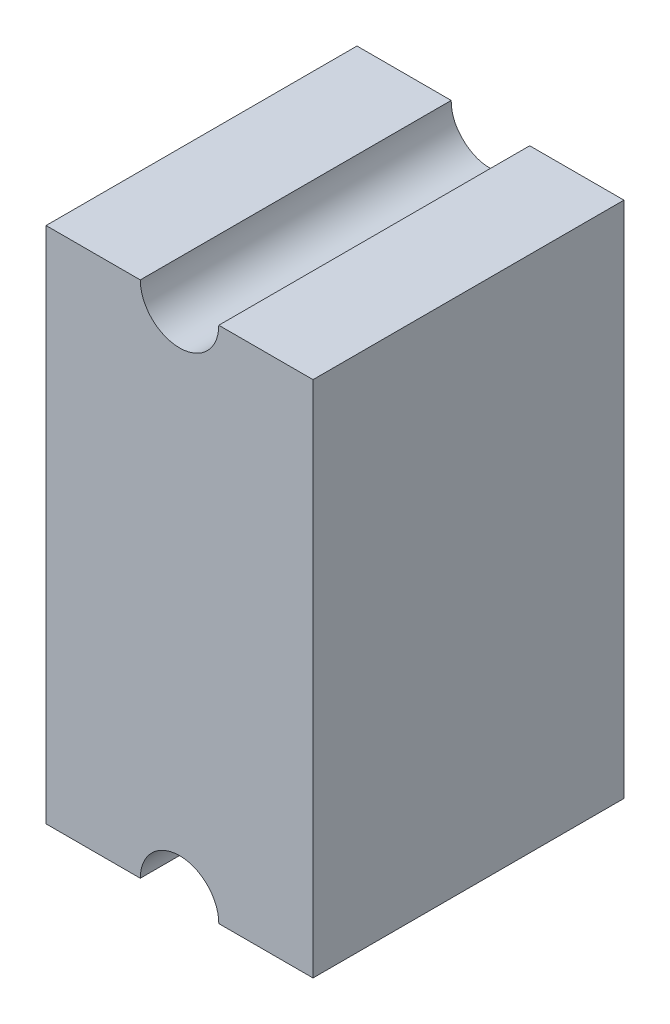
ISO-10303-21;
HEADER;
FILE_DESCRIPTION(('STEP AP214'),'2;1');
FILE_NAME('part.step','',(''),(''),'','','');
FILE_SCHEMA(('AUTOMOTIVE_DESIGN { 1 0 10303 214 1 1 1 1 }'));
ENDSEC;
DATA;
#1=APPLICATION_CONTEXT('core data for automotive mechanical design processes');
#2=APPLICATION_PROTOCOL_DEFINITION('international standard','automotive_design',2000,#1);
#3=PRODUCT_CONTEXT('',#1,'mechanical');
#4=PRODUCT('Part','Part','',(#3));
#5=PRODUCT_RELATED_PRODUCT_CATEGORY('part','',(#4));
#6=PRODUCT_DEFINITION_FORMATION('','',#4);
#7=PRODUCT_DEFINITION_CONTEXT('part definition',#1,'design');
#8=PRODUCT_DEFINITION('design','',#6,#7);
#9=PRODUCT_DEFINITION_SHAPE('','',#8);
#10=(LENGTH_UNIT() NAMED_UNIT(*) SI_UNIT(.MILLI.,.METRE.));
#11=(NAMED_UNIT(*) PLANE_ANGLE_UNIT() SI_UNIT($,.RADIAN.));
#12=(NAMED_UNIT(*) SI_UNIT($,.STERADIAN.) SOLID_ANGLE_UNIT());
#13=UNCERTAINTY_MEASURE_WITH_UNIT(LENGTH_MEASURE(1.E-05),#10,'distance_accuracy_value','');
#14=(GEOMETRIC_REPRESENTATION_CONTEXT(3) GLOBAL_UNCERTAINTY_ASSIGNED_CONTEXT((#13)) GLOBAL_UNIT_ASSIGNED_CONTEXT((#10,
#11,#12)) REPRESENTATION_CONTEXT('',''));
#15=CARTESIAN_POINT('',(0.,0.,0.));
#16=DIRECTION('',(0.,0.,1.));
#17=DIRECTION('',(1.,0.,0.));
#18=AXIS2_PLACEMENT_3D('',#15,#16,#17);
#19=CARTESIAN_POINT('',(-7.018385304232,-14.99348643989,-2.61150951267));
#20=DIRECTION('',(8.74227755153593E-08,-8.74227776159793E-08,0.999999999999992));
#21=DIRECTION('',(0.,-0.999999999999996,-8.74227776159797E-08));
#22=AXIS2_PLACEMENT_3D('',#19,#20,#21);
#23=PLANE('',#22);
#24=CARTESIAN_POINT('',(-6.718385304828,-15.04348643631,-2.61150954326797));
#25=DIRECTION('',(-0.999999999999996,0.,8.74227753560529E-08));
#26=VECTOR('',#25,1.);
#27=LINE('',#24,#26);
#28=CARTESIAN_POINT('',(-6.718385304236,-15.043486439885,-2.61155954326797));
#29=VERTEX_POINT('',#28);
#30=CARTESIAN_POINT('',(-7.318385304236,-15.043486439885,-2.61155949081431));
#31=VERTEX_POINT('',#30);
#32=EDGE_CURVE('E144',#29,#31,#27,.T.);
#33=ORIENTED_EDGE('',*,*,#32,.T.);
#34=CARTESIAN_POINT('',(-7.318385303635,-15.04348643631,-2.61150949081431));
#35=DIRECTION('',(0.,0.999999999999996,8.74227792732975E-08));
#36=VECTOR('',#35,1.);
#37=LINE('',#34,#36);
#38=CARTESIAN_POINT('',(-7.318385304236,-14.94348643989,-2.61155948207203));
#39=VERTEX_POINT('',#38);
#40=EDGE_CURVE('E219',#31,#39,#37,.T.);
#41=ORIENTED_EDGE('',*,*,#40,.T.);
#42=CARTESIAN_POINT('',(-7.318385303635,-14.94348644347,-2.61150948207203));
#43=DIRECTION('',(0.999999999999996,0.,-8.74227753560529E-08));
#44=VECTOR('',#43,1.);
#45=LINE('',#42,#44);
#46=CARTESIAN_POINT('',(-6.718385304236,-14.94348643989,-2.61155953452569));
#47=VERTEX_POINT('',#46);
#48=EDGE_CURVE('E207',#39,#47,#45,.T.);
#49=ORIENTED_EDGE('',*,*,#48,.T.);
#50=CARTESIAN_POINT('',(-6.718385304828,-14.94348644347,-2.61150953452569));
#51=DIRECTION('',(0.,-0.999999999999996,-8.74227792732975E-08));
#52=VECTOR('',#51,1.);
#53=LINE('',#50,#52);
#54=EDGE_CURVE('E369',#47,#29,#53,.T.);
#55=ORIENTED_EDGE('',*,*,#54,.T.);
#56=EDGE_LOOP('',(#33,#41,#49,#55));
#57=FACE_BOUND('',#56,.T.);
#58=ADVANCED_FACE('F17',(#57),#23,.F.);
#59=CARTESIAN_POINT('',(-7.018385295419,-14.25446878829,-2.611509448063));
#60=DIRECTION('',(8.74227755153593E-08,-8.74227776159793E-08,0.999999999999992));
#61=DIRECTION('',(0.,-0.999999999999996,-8.74227776159797E-08));
#62=AXIS2_PLACEMENT_3D('',#59,#60,#61);
#63=PLANE('',#62);
#64=DIRECTION('',(1.,-1.19248800417599E-08,0.));
#65=VECTOR('',#64,1.);
#66=CARTESIAN_POINT('',(-6.593385294402,-14.1684864449587,-2.611509455845));
#67=LINE('',#66,#65);
#68=CARTESIAN_POINT('',(-6.843385294398,-14.1684864419741,-2.61155945584509));
#69=VERTEX_POINT('',#68);
#70=CARTESIAN_POINT('',(-6.89338529439382,-14.168486441381,-2.61150945365968));
#71=VERTEX_POINT('',#70);
#72=EDGE_CURVE('E141',#69,#71,#67,.F.);
#73=ORIENTED_EDGE('',*,*,#72,.F.);
#74=CARTESIAN_POINT('',(-6.843385294394,-14.16848644198,-2.61150945584517));
#75=CARTESIAN_POINT('',(-6.84338529527116,-14.2419328941304,-2.61150946226606));
#76=CARTESIAN_POINT('',(-6.89464160916365,-14.2922301280749,-2.61150946218222));
#77=CARTESIAN_POINT('',(-6.94745987459995,-14.3440600871852,-2.61150946209582));
#78=CARTESIAN_POINT('',(-7.01838529648243,-14.34348643989,-2.61150945584517));
#79=CARTESIAN_POINT('',(-7.09241933342863,-14.3428876500073,-2.61150944932056));
#80=CARTESIAN_POINT('',(-7.14212898257783,-14.2922301251205,-2.61150944054618));
#81=CARTESIAN_POINT('',(-7.19338529524675,-14.2399964445561,-2.6115094314988));
#82=CARTESIAN_POINT('',(-7.193385294394,-14.1684864378,-2.6115094252472));
#83=B_SPLINE_CURVE_WITH_KNOTS('',2,(#74,#75,#76,#77,#78,#79,#80,#81,#82),.UNSPECIFIED.,.F.,.F.,
(3,2,2,2,3),(0.,0.25,0.5,0.75,1.),.UNSPECIFIED.);
#84=CARTESIAN_POINT('',(-7.193385294398,-14.1684864378006,-2.61155942524741));
#85=VERTEX_POINT('',#84);
#86=EDGE_CURVE('E151',#69,#85,#83,.T.);
#87=ORIENTED_EDGE('',*,*,#86,.T.);
#88=DIRECTION('',(1.,-1.19248800417599E-08,0.));
#89=VECTOR('',#88,1.);
#90=CARTESIAN_POINT('',(-7.143385294402,-14.1684864383987,-2.611509429619));
#91=LINE('',#90,#89);
#92=CARTESIAN_POINT('',(-7.14338525112381,-14.1684864383994,-2.61150942961883));
#93=VERTEX_POINT('',#92);
#94=EDGE_CURVE('E116',#93,#85,#91,.F.);
#95=ORIENTED_EDGE('',*,*,#94,.F.);
#96=CARTESIAN_POINT('',(-7.143385294394,-14.1684864384,-2.61150942961834));
#97=CARTESIAN_POINT('',(-7.14338529501934,-14.2209481899363,-2.61150943420469));
#98=CARTESIAN_POINT('',(-7.10677364309602,-14.2568747864846,-2.61150944054618));
#99=CARTESIAN_POINT('',(-7.06904631152456,-14.2938961867495,-2.61150944708093));
#100=CARTESIAN_POINT('',(-7.0183852958843,-14.29348643989,-2.61150945147403));
#101=CARTESIAN_POINT('',(-6.96550384091234,-14.2930587340925,-2.61150945605968));
#102=CARTESIAN_POINT('',(-6.9299969477996,-14.2568747885921,-2.61150945600049));
#103=CARTESIAN_POINT('',(-6.89338529500311,-14.219565017634,-2.61150945593946));
#104=CARTESIAN_POINT('',(-6.893385294394,-14.16848644138,-2.61150945147403));
#105=B_SPLINE_CURVE_WITH_KNOTS('',2,(#96,#97,#98,#99,#100,#101,#102,#103,#104),.UNSPECIFIED.,
.F.,.F.,(3,2,2,2,3),(0.,0.25,0.5,0.75,1.),.UNSPECIFIED.);
#106=EDGE_CURVE('E327',#93,#71,#105,.T.);
#107=ORIENTED_EDGE('',*,*,#106,.T.);
#108=EDGE_LOOP('',(#73,#87,#95,#107));
#109=FACE_BOUND('',#108,.T.);
#110=ADVANCED_FACE('F352',(#109),#63,.F.);
#111=CARTESIAN_POINT('',(-7.443385294402,-14.16848643481,-2.611609403392));
#112=DIRECTION('',(-0.999999999999996,1.192487239902E-08,8.74227765578597E-08));
#113=DIRECTION('',(8.74227765578597E-08,0.,0.999999999999996));
#114=AXIS2_PLACEMENT_3D('',#111,#112,#113);
#115=PLANE('',#114);
#116=DIRECTION('',(0.,-0.999999999999996,-8.74227776159797E-08));
#117=VECTOR('',#116,1.);
#118=CARTESIAN_POINT('',(-7.443385207854,-14.99348652643,-1.62160947551532));
#119=LINE('',#118,#117);
#120=CARTESIAN_POINT('',(-7.44338523670333,-14.168486523747,-1.62160940339153));
#121=VERTEX_POINT('',#120);
#122=CARTESIAN_POINT('',(-7.44338521441267,-15.8184865213595,-1.62160954763911));
#123=VERTEX_POINT('',#122);
#124=EDGE_CURVE('E126',#121,#123,#119,.T.);
#125=ORIENTED_EDGE('',*,*,#124,.F.);
#126=DIRECTION('',(0.,-8.74227765734797E-08,0.999999999999996));
#127=VECTOR('',#126,1.);
#128=CARTESIAN_POINT('',(-7.443385294402,-14.1684864348125,-2.611609429619));
#129=LINE('',#128,#127);
#130=CARTESIAN_POINT('',(-7.443385294402,-14.1684864368042,-2.61160941067702));
#131=VERTEX_POINT('',#130);
#132=EDGE_CURVE('E322',#131,#121,#129,.T.);
#133=ORIENTED_EDGE('',*,*,#132,.F.);
#134=DIRECTION('',(0.,-0.999999999999996,-8.74227776159797E-08));
#135=VECTOR('',#134,1.);
#136=CARTESIAN_POINT('',(-7.443385294402,-14.99348643988,-2.61160947551532));
#137=LINE('',#136,#135);
#138=CARTESIAN_POINT('',(-7.44338527211133,-15.81848643481,-2.61160954763908));
#139=VERTEX_POINT('',#138);
#140=EDGE_CURVE('E232',#131,#139,#137,.T.);
#141=ORIENTED_EDGE('',*,*,#140,.T.);
#142=DIRECTION('',(0.,8.74227765734797E-08,-0.999999999999996));
#143=VECTOR('',#142,1.);
#144=CARTESIAN_POINT('',(-7.44338522753,-15.81848643481,-2.611609547639));
#145=LINE('',#144,#143);
#146=EDGE_CURVE('E341',#123,#139,#145,.T.);
#147=ORIENTED_EDGE('',*,*,#146,.F.);
#148=EDGE_LOOP('',(#125,#133,#141,#147));
#149=FACE_BOUND('',#148,.T.);
#150=ADVANCED_FACE('F360',(#149),#115,.T.);
#151=CARTESIAN_POINT('',(-7.443385314078,-15.81848643481,-2.611609547639));
#152=DIRECTION('',(-1.192488004176E-08,-0.999999999999996,-8.74227765734797E-08));
#153=DIRECTION('',(0.,8.74227765734797E-08,-0.999999999999996));
#154=AXIS2_PLACEMENT_3D('',#151,#152,#153);
#155=PLANE('',#154);
#156=ORIENTED_EDGE('',*,*,#146,.T.);
#157=DIRECTION('',(0.999999999999996,0.,-8.7422775515359E-08));
#158=VECTOR('',#157,1.);
#159=CARTESIAN_POINT('',(-7.01838530424,-15.81848643481,-2.61160958479379));
#160=LINE('',#159,#158);
#161=CARTESIAN_POINT('',(-7.193385314074,-15.8184864378,-2.61155956949482));
#162=VERTEX_POINT('',#161);
#163=EDGE_CURVE('E239',#139,#162,#160,.T.);
#164=ORIENTED_EDGE('',*,*,#163,.T.);
#165=DIRECTION('',(0.999999999999996,0.,-8.7422775515359E-08));
#166=VECTOR('',#165,1.);
#167=CARTESIAN_POINT('',(-7.018385313044,-15.8184864378,-2.61150958479382));
#168=LINE('',#167,#166);
#169=CARTESIAN_POINT('',(-7.14338531406963,-15.8184864384,-2.61150957386614));
#170=VERTEX_POINT('',#169);
#171=EDGE_CURVE('E113',#162,#170,#168,.T.);
#172=ORIENTED_EDGE('',*,*,#171,.T.);
#173=DIRECTION('',(8.74227755153593E-08,-8.74227776159793E-08,0.999999999999992));
#174=VECTOR('',#173,1.);
#175=CARTESIAN_POINT('',(-7.143385314078,-15.8184864383913,-2.61160957386615));
#176=LINE('',#175,#174);
#177=CARTESIAN_POINT('',(-7.14338522752945,-15.8184865231499,-1.621609573866));
#178=VERTEX_POINT('',#177);
#179=EDGE_CURVE('E105',#170,#178,#176,.T.);
#180=ORIENTED_EDGE('',*,*,#179,.T.);
#181=DIRECTION('',(0.999999999999996,0.,-8.7422775515359E-08));
#182=VECTOR('',#181,1.);
#183=CARTESIAN_POINT('',(-7.018385217692,-15.81848652136,-1.62160958479379));
#184=LINE('',#183,#182);
#185=EDGE_CURVE('E110',#123,#178,#184,.T.);
#186=ORIENTED_EDGE('',*,*,#185,.F.);
#187=EDGE_LOOP('',(#156,#164,#172,#180,#186));
#188=FACE_BOUND('',#187,.T.);
#189=ADVANCED_FACE('F108',(#188),#155,.T.);
#190=CARTESIAN_POINT('',(-7.018385294402,-14.16848643988,-2.611609440547));
#191=DIRECTION('',(8.74227755153593E-08,-8.74227776159793E-08,0.999999999999992));
#192=DIRECTION('',(0.,-0.999999999999996,-8.74227776159797E-08));
#193=AXIS2_PLACEMENT_3D('',#190,#191,#192);
#194=CYLINDRICAL_SURFACE('',#193,0.125);
#195=DIRECTION('',(0.,-8.74227765734797E-08,0.999999999999996));
#196=VECTOR('',#195,1.);
#197=CARTESIAN_POINT('',(-7.143385207854,-14.16848643839,-2.611609429619));
#198=LINE('',#197,#196);
#199=CARTESIAN_POINT('',(-7.14338520785373,-14.1684865249393,-1.62160942961831));
#200=VERTEX_POINT('',#199);
#201=EDGE_CURVE('E317',#200,#93,#198,.F.);
#202=ORIENTED_EDGE('',*,*,#201,.F.);
#203=CARTESIAN_POINT('',(-7.01838520785345,-14.1684865264286,-1.62160944054615));
#204=DIRECTION('',(8.74227755153593E-08,-8.74227776159793E-08,0.999999999999992));
#205=DIRECTION('',(0.,-0.999999999999996,-8.74227776159797E-08));
#206=AXIS2_PLACEMENT_3D('',#203,#204,#205);
#207=CIRCLE('',#206,0.125);
#208=CARTESIAN_POINT('',(-6.89338525112373,-14.1684865297105,-1.621609451474));
#209=VERTEX_POINT('',#208);
#210=EDGE_CURVE('E270',#209,#200,#207,.F.);
#211=ORIENTED_EDGE('',*,*,#210,.F.);
#212=DIRECTION('',(0.,-8.74227765734797E-08,0.999999999999996));
#213=VECTOR('',#212,1.);
#214=CARTESIAN_POINT('',(-6.893385294394,-14.1684864413725,-2.611609477701));
#215=LINE('',#214,#213);
#216=EDGE_CURVE('E138',#71,#209,#215,.T.);
#217=ORIENTED_EDGE('',*,*,#216,.F.);
#218=ORIENTED_EDGE('',*,*,#106,.F.);
#219=EDGE_LOOP('',(#202,#211,#217,#218));
#220=FACE_BOUND('',#219,.T.);
#221=ADVANCED_FACE('F261',(#220),#194,.F.);
#222=CARTESIAN_POINT('',(-7.143385294402,-14.16848643839,-2.611609429619));
#223=DIRECTION('',(1.192488004176E-08,0.999999999999996,8.74227765734797E-08));
#224=DIRECTION('',(0.,-8.74227765734797E-08,0.999999999999996));
#225=AXIS2_PLACEMENT_3D('',#222,#223,#224);
#226=PLANE('',#225);
#227=ORIENTED_EDGE('',*,*,#201,.T.);
#228=ORIENTED_EDGE('',*,*,#94,.T.);
#229=DIRECTION('',(0.999999999999996,0.,-8.7422775515359E-08));
#230=VECTOR('',#229,1.);
#231=CARTESIAN_POINT('',(-7.01838530424,-14.1684864378,-2.61160944054621));
#232=LINE('',#231,#230);
#233=EDGE_CURVE('E240',#85,#131,#232,.F.);
#234=ORIENTED_EDGE('',*,*,#233,.T.);
#235=ORIENTED_EDGE('',*,*,#132,.T.);
#236=DIRECTION('',(0.999999999999996,0.,-8.7422775515359E-08));
#237=VECTOR('',#236,1.);
#238=CARTESIAN_POINT('',(-7.018385217692,-14.16848652494,-1.62160944054621));
#239=LINE('',#238,#237);
#240=EDGE_CURVE('E276',#200,#121,#239,.F.);
#241=ORIENTED_EDGE('',*,*,#240,.F.);
#242=EDGE_LOOP('',(#227,#228,#234,#235,#241));
#243=FACE_BOUND('',#242,.T.);
#244=ADVANCED_FACE('F258',(#243),#226,.T.);
#245=CARTESIAN_POINT('',(-7.018385314078,-15.81848643988,-2.611609584794));
#246=DIRECTION('',(8.74227755153593E-08,-8.74227776159793E-08,0.999999999999992));
#247=DIRECTION('',(0.,-0.999999999999996,-8.74227776159797E-08));
#248=AXIS2_PLACEMENT_3D('',#245,#246,#247);
#249=CYLINDRICAL_SURFACE('',#248,0.125);
#250=DIRECTION('',(0.,8.74227765734797E-08,-0.999999999999996));
#251=VECTOR('',#250,1.);
#252=CARTESIAN_POINT('',(-6.89338522753,-15.81848644137,-2.611609595722));
#253=LINE('',#252,#251);
#254=CARTESIAN_POINT('',(-6.89338522753,-15.8184865279185,-1.62160960883535));
#255=VERTEX_POINT('',#254);
#256=CARTESIAN_POINT('',(-6.89338527079981,-15.8184864413794,-2.61150959572192));
#257=VERTEX_POINT('',#256);
#258=EDGE_CURVE('E121',#255,#257,#253,.T.);
#259=ORIENTED_EDGE('',*,*,#258,.F.);
#260=CARTESIAN_POINT('',(-7.01838522752945,-15.8184865264286,-1.62160958479385));
#261=DIRECTION('',(8.74227755153593E-08,-8.74227776159793E-08,0.999999999999992));
#262=DIRECTION('',(0.,-0.999999999999996,-8.74227776159797E-08));
#263=AXIS2_PLACEMENT_3D('',#260,#261,#262);
#264=CIRCLE('',#263,0.125);
#265=EDGE_CURVE('E21',#178,#255,#264,.F.);
#266=ORIENTED_EDGE('',*,*,#265,.F.);
#267=ORIENTED_EDGE('',*,*,#179,.F.);
#268=CARTESIAN_POINT('',(-7.01838531406926,-15.8184864398887,-2.61150958479415));
#269=DIRECTION('',(-8.74227755153593E-08,8.74227776159793E-08,-0.999999999999992));
#270=DIRECTION('',(-0.999999999999996,1.1909945252242E-08,8.74227773506322E-08));
#271=AXIS2_PLACEMENT_3D('',#268,#269,#270);
#272=CIRCLE('',#271,0.125);
#273=EDGE_CURVE('E244',#170,#257,#272,.T.);
#274=ORIENTED_EDGE('',*,*,#273,.T.);
#275=EDGE_LOOP('',(#259,#266,#267,#274));
#276=FACE_BOUND('',#275,.T.);
#277=ADVANCED_FACE('F119',(#276),#249,.F.);
#278=CARTESIAN_POINT('',(-7.018385313044,-15.7325040915,-2.611509577277));
#279=DIRECTION('',(8.74227755153593E-08,-8.74227776159793E-08,0.999999999999992));
#280=DIRECTION('',(0.,-0.999999999999996,-8.74227776159797E-08));
#281=AXIS2_PLACEMENT_3D('',#278,#279,#280);
#282=PLANE('',#281);
#283=ORIENTED_EDGE('',*,*,#171,.F.);
#284=CARTESIAN_POINT('',(-7.19338531407,-15.8184864378,-2.61150956949483));
#285=CARTESIAN_POINT('',(-7.19338531319284,-15.7450399856495,-2.61150956307394));
#286=CARTESIAN_POINT('',(-7.14212899930035,-15.6947427517051,-2.61150956315778));
#287=CARTESIAN_POINT('',(-7.08931073386404,-15.6429127925948,-2.61150956324418));
#288=CARTESIAN_POINT('',(-7.01838531198157,-15.64348643989,-2.61150956949483));
#289=CARTESIAN_POINT('',(-6.9443512750354,-15.6440852297727,-2.61150957601944));
#290=CARTESIAN_POINT('',(-6.89464162588617,-15.6947427546595,-2.61150958479382));
#291=CARTESIAN_POINT('',(-6.84338531321725,-15.7469764352239,-2.6115095938412));
#292=CARTESIAN_POINT('',(-6.84338531407,-15.81848644198,-2.6115096000928));
#293=B_SPLINE_CURVE_WITH_KNOTS('',2,(#284,#285,#286,#287,#288,#289,#290,#291,#292),
.UNSPECIFIED.,.F.,.F.,(3,2,2,2,3),(0.,0.25,0.5,0.75,1.),.UNSPECIFIED.);
#294=CARTESIAN_POINT('',(-6.843385314074,-15.8184864419728,-2.61155960009289));
#295=VERTEX_POINT('',#294);
#296=EDGE_CURVE('E370',#162,#295,#293,.T.);
#297=ORIENTED_EDGE('',*,*,#296,.T.);
#298=DIRECTION('',(1.,-1.19248800417599E-08,0.));
#299=VECTOR('',#298,1.);
#300=CARTESIAN_POINT('',(-6.893385314078,-15.8184864413787,-2.611509595722));
#301=LINE('',#300,#299);
#302=EDGE_CURVE('E290',#257,#295,#301,.T.);
#303=ORIENTED_EDGE('',*,*,#302,.F.);
#304=ORIENTED_EDGE('',*,*,#273,.F.);
#305=EDGE_LOOP('',(#283,#297,#303,#304));
#306=FACE_BOUND('',#305,.T.);
#307=ADVANCED_FACE('F169',(#306),#282,.F.);
#308=CARTESIAN_POINT('',(-7.01838530424,-14.99348643988,-2.61160951267));
#309=DIRECTION('',(8.74227755153593E-08,-8.74227776159793E-08,0.999999999999992));
#310=DIRECTION('',(0.,-0.999999999999996,-8.74227776159797E-08));
#311=AXIS2_PLACEMENT_3D('',#308,#309,#310);
#312=PLANE('',#311);
#313=ORIENTED_EDGE('',*,*,#54,.F.);
#314=ORIENTED_EDGE('',*,*,#48,.F.);
#315=ORIENTED_EDGE('',*,*,#40,.F.);
#316=ORIENTED_EDGE('',*,*,#32,.F.);
#317=EDGE_LOOP('',(#313,#314,#315,#316));
#318=FACE_BOUND('',#317,.T.);
#319=ORIENTED_EDGE('',*,*,#163,.F.);
#320=ORIENTED_EDGE('',*,*,#140,.F.);
#321=ORIENTED_EDGE('',*,*,#233,.F.);
#322=ORIENTED_EDGE('',*,*,#86,.F.);
#323=DIRECTION('',(1.,-1.19248800417599E-08,0.));
#324=VECTOR('',#323,1.);
#325=CARTESIAN_POINT('',(-6.593385294402,-14.16848644495,-2.611609477701));
#326=LINE('',#325,#324);
#327=CARTESIAN_POINT('',(-6.59338526555264,-14.16848644495,-2.61160953780432));
#328=VERTEX_POINT('',#327);
#329=EDGE_CURVE('E128',#328,#69,#326,.F.);
#330=ORIENTED_EDGE('',*,*,#329,.F.);
#331=DIRECTION('',(1.19248723149099E-08,1.,0.));
#332=VECTOR('',#331,1.);
#333=CARTESIAN_POINT('',(-6.593385314078,-15.81848644495,-2.611609621949));
#334=LINE('',#333,#332);
#335=CARTESIAN_POINT('',(-6.593385314078,-15.8184864882237,-2.61160960828887));
#336=VERTEX_POINT('',#335);
#337=EDGE_CURVE('E292',#336,#328,#334,.T.);
#338=ORIENTED_EDGE('',*,*,#337,.F.);
#339=DIRECTION('',(1.,-1.19248800417599E-08,0.));
#340=VECTOR('',#339,1.);
#341=CARTESIAN_POINT('',(-6.893385314078,-15.81848644137,-2.611609600093));
#342=LINE('',#341,#340);
#343=EDGE_CURVE('E279',#295,#336,#342,.T.);
#344=ORIENTED_EDGE('',*,*,#343,.F.);
#345=ORIENTED_EDGE('',*,*,#296,.F.);
#346=EDGE_LOOP('',(#319,#320,#321,#322,#330,#338,#344,#345));
#347=FACE_BOUND('',#346,.T.);
#348=ADVANCED_FACE('F158',(#318,#347),#312,.F.);
#349=CARTESIAN_POINT('',(-6.593385294402,-14.16848644495,-2.611609477701));
#350=DIRECTION('',(1.192488004176E-08,0.999999999999996,8.74227765734797E-08));
#351=DIRECTION('',(0.,-8.74227765734797E-08,0.999999999999996));
#352=AXIS2_PLACEMENT_3D('',#349,#350,#351);
#353=PLANE('',#352);
#354=DIRECTION('',(-8.74227765578597E-08,0.,-0.999999999999996));
#355=VECTOR('',#354,1.);
#356=CARTESIAN_POINT('',(-6.59338529440196,-14.16848644495,-2.611609621949));
#357=LINE('',#356,#355);
#358=CARTESIAN_POINT('',(-6.5933852176917,-14.1684865206809,-1.62160947770094));
#359=VERTEX_POINT('',#358);
#360=EDGE_CURVE('E295',#328,#359,#357,.F.);
#361=ORIENTED_EDGE('',*,*,#360,.F.);
#362=ORIENTED_EDGE('',*,*,#329,.T.);
#363=ORIENTED_EDGE('',*,*,#72,.T.);
#364=ORIENTED_EDGE('',*,*,#216,.T.);
#365=DIRECTION('',(0.999999999999996,0.,-8.7422775515359E-08));
#366=VECTOR('',#365,1.);
#367=CARTESIAN_POINT('',(-7.018385217692,-14.1684865315,-1.62160944054621));
#368=LINE('',#367,#366);
#369=EDGE_CURVE('E122',#359,#209,#368,.F.);
#370=ORIENTED_EDGE('',*,*,#369,.F.);
#371=EDGE_LOOP('',(#361,#362,#363,#364,#370));
#372=FACE_BOUND('',#371,.T.);
#373=ADVANCED_FACE('F168',(#372),#353,.T.);
#374=CARTESIAN_POINT('',(-7.018385217692,-14.99348652643,-1.62160951267));
#375=DIRECTION('',(8.74227755153593E-08,-8.74227776159793E-08,0.999999999999992));
#376=DIRECTION('',(0.,-0.999999999999996,-8.74227776159797E-08));
#377=AXIS2_PLACEMENT_3D('',#374,#375,#376);
#378=PLANE('',#377);
#379=ORIENTED_EDGE('',*,*,#210,.T.);
#380=ORIENTED_EDGE('',*,*,#240,.T.);
#381=ORIENTED_EDGE('',*,*,#124,.T.);
#382=ORIENTED_EDGE('',*,*,#185,.T.);
#383=ORIENTED_EDGE('',*,*,#265,.T.);
#384=DIRECTION('',(1.,-1.19248800417599E-08,0.));
#385=VECTOR('',#384,1.);
#386=CARTESIAN_POINT('',(-6.893385314078,-15.8184865279185,-1.621609621949));
#387=LINE('',#386,#385);
#388=CARTESIAN_POINT('',(-6.59338524916686,-15.818486531496,-1.621609621949));
#389=VERTEX_POINT('',#388);
#390=EDGE_CURVE('E36',#389,#255,#387,.F.);
#391=ORIENTED_EDGE('',*,*,#390,.F.);
#392=DIRECTION('',(1.19248723149099E-08,1.,0.));
#393=VECTOR('',#392,1.);
#394=CARTESIAN_POINT('',(-6.59338522752944,-15.81848644495,-1.621609477701));
#395=LINE('',#394,#393);
#396=EDGE_CURVE('E27',#359,#389,#395,.F.);
#397=ORIENTED_EDGE('',*,*,#396,.F.);
#398=ORIENTED_EDGE('',*,*,#369,.T.);
#399=EDGE_LOOP('',(#379,#380,#381,#382,#383,#391,#397,#398));
#400=FACE_BOUND('',#399,.T.);
#401=ADVANCED_FACE('F124',(#400),#378,.T.);
#402=CARTESIAN_POINT('',(-6.893385314078,-15.81848644137,-2.611609595722));
#403=DIRECTION('',(-1.192488004176E-08,-0.999999999999996,-8.74227765734797E-08));
#404=DIRECTION('',(0.,8.74227765734797E-08,-0.999999999999996));
#405=AXIS2_PLACEMENT_3D('',#402,#403,#404);
#406=PLANE('',#405);
#407=ORIENTED_EDGE('',*,*,#258,.T.);
#408=ORIENTED_EDGE('',*,*,#302,.T.);
#409=ORIENTED_EDGE('',*,*,#343,.T.);
#410=DIRECTION('',(-8.74227765578597E-08,0.,-0.999999999999996));
#411=VECTOR('',#410,1.);
#412=CARTESIAN_POINT('',(-6.593385314078,-15.8184865315,-2.611609621949));
#413=LINE('',#412,#411);
#414=EDGE_CURVE('E11',#389,#336,#413,.T.);
#415=ORIENTED_EDGE('',*,*,#414,.F.);
#416=ORIENTED_EDGE('',*,*,#390,.T.);
#417=EDGE_LOOP('',(#407,#408,#409,#415,#416));
#418=FACE_BOUND('',#417,.T.);
#419=ADVANCED_FACE('F399',(#418),#406,.T.);
#420=CARTESIAN_POINT('',(-6.593385314078,-15.81848644495,-2.611609621949));
#421=DIRECTION('',(0.999999999999996,-1.192487231491E-08,-8.74227765578597E-08));
#422=DIRECTION('',(-8.74227765578597E-08,0.,-0.999999999999996));
#423=AXIS2_PLACEMENT_3D('',#420,#421,#422);
#424=PLANE('',#423);
#425=ORIENTED_EDGE('',*,*,#396,.T.);
#426=ORIENTED_EDGE('',*,*,#414,.T.);
#427=ORIENTED_EDGE('',*,*,#337,.T.);
#428=ORIENTED_EDGE('',*,*,#360,.T.);
#429=EDGE_LOOP('',(#425,#426,#427,#428));
#430=FACE_BOUND('',#429,.T.);
#431=ADVANCED_FACE('F401',(#430),#424,.T.);
#432=CLOSED_SHELL('',(#58,#110,#150,#189,#221,#244,#277,#307,#348,#373,#401,#419,#431));
#433=MANIFOLD_SOLID_BREP('B1',#432);
#434=ADVANCED_BREP_SHAPE_REPRESENTATION('',(#18,#433),#14);
#435=SHAPE_DEFINITION_REPRESENTATION(#9,#434);
ENDSEC;
END-ISO-10303-21;
